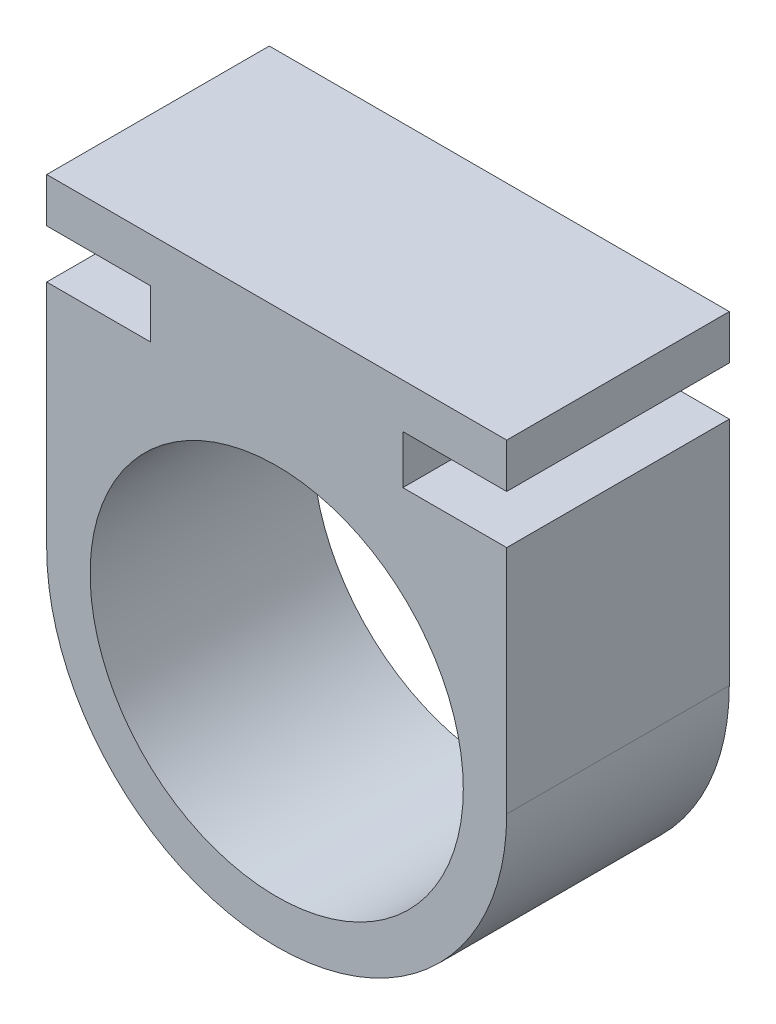
ISO-10303-21;
HEADER;
FILE_DESCRIPTION(('STEP AP214'),'2;1');
FILE_NAME('part.step','',(''),(''),'','','');
FILE_SCHEMA(('AUTOMOTIVE_DESIGN { 1 0 10303 214 1 1 1 1 }'));
ENDSEC;
DATA;
#1=APPLICATION_CONTEXT('core data for automotive mechanical design processes');
#2=APPLICATION_PROTOCOL_DEFINITION('international standard','automotive_design',2000,#1);
#3=PRODUCT_CONTEXT('',#1,'mechanical');
#4=PRODUCT('Part','Part','',(#3));
#5=PRODUCT_RELATED_PRODUCT_CATEGORY('part','',(#4));
#6=PRODUCT_DEFINITION_FORMATION('','',#4);
#7=PRODUCT_DEFINITION_CONTEXT('part definition',#1,'design');
#8=PRODUCT_DEFINITION('design','',#6,#7);
#9=PRODUCT_DEFINITION_SHAPE('','',#8);
#10=(LENGTH_UNIT() NAMED_UNIT(*) SI_UNIT(.MILLI.,.METRE.));
#11=(NAMED_UNIT(*) PLANE_ANGLE_UNIT() SI_UNIT($,.RADIAN.));
#12=(NAMED_UNIT(*) SI_UNIT($,.STERADIAN.) SOLID_ANGLE_UNIT());
#13=UNCERTAINTY_MEASURE_WITH_UNIT(LENGTH_MEASURE(1.E-05),#10,'distance_accuracy_value','');
#14=(GEOMETRIC_REPRESENTATION_CONTEXT(3) GLOBAL_UNCERTAINTY_ASSIGNED_CONTEXT((#13)) GLOBAL_UNIT_ASSIGNED_CONTEXT((#10,
#11,#12)) REPRESENTATION_CONTEXT('',''));
#15=CARTESIAN_POINT('',(0.,0.,0.));
#16=DIRECTION('',(0.,0.,1.));
#17=DIRECTION('',(1.,0.,0.));
#18=AXIS2_PLACEMENT_3D('',#15,#16,#17);
#19=CARTESIAN_POINT('',(0.,0.,15.));
#20=DIRECTION('',(0.,0.,-1.));
#21=DIRECTION('',(-1.,0.,0.));
#22=AXIS2_PLACEMENT_3D('',#19,#20,#21);
#23=CYLINDRICAL_SURFACE('',#22,15.5);
#24=CARTESIAN_POINT('',(0.,0.,0.));
#25=DIRECTION('',(0.,0.,1.));
#26=DIRECTION('',(1.,0.,0.));
#27=AXIS2_PLACEMENT_3D('',#24,#25,#26);
#28=CIRCLE('',#27,15.5);
#29=CARTESIAN_POINT('',(-15.5,0.,0.));
#30=VERTEX_POINT('',#29);
#31=CARTESIAN_POINT('',(15.5,0.,0.));
#32=VERTEX_POINT('',#31);
#33=EDGE_CURVE('E162',#30,#32,#28,.T.);
#34=ORIENTED_EDGE('',*,*,#33,.T.);
#35=DIRECTION('',(0.,0.,-1.));
#36=VECTOR('',#35,1.);
#37=CARTESIAN_POINT('',(15.5,0.,15.));
#38=LINE('',#37,#36);
#39=CARTESIAN_POINT('',(15.5,0.,15.));
#40=VERTEX_POINT('',#39);
#41=EDGE_CURVE('E11',#40,#32,#38,.T.);
#42=ORIENTED_EDGE('',*,*,#41,.F.);
#43=CARTESIAN_POINT('',(0.,0.,15.));
#44=DIRECTION('',(0.,0.,1.));
#45=DIRECTION('',(1.,0.,0.));
#46=AXIS2_PLACEMENT_3D('',#43,#44,#45);
#47=CIRCLE('',#46,15.5);
#48=CARTESIAN_POINT('',(-15.5,0.,15.));
#49=VERTEX_POINT('',#48);
#50=EDGE_CURVE('E194',#49,#40,#47,.T.);
#51=ORIENTED_EDGE('',*,*,#50,.F.);
#52=DIRECTION('',(0.,0.,-1.));
#53=VECTOR('',#52,1.);
#54=CARTESIAN_POINT('',(-15.5,0.,15.));
#55=LINE('',#54,#53);
#56=EDGE_CURVE('E50',#49,#30,#55,.T.);
#57=ORIENTED_EDGE('',*,*,#56,.T.);
#58=EDGE_LOOP('',(#34,#42,#51,#57));
#59=FACE_BOUND('',#58,.T.);
#60=ADVANCED_FACE('F34',(#59),#23,.T.);
#61=CARTESIAN_POINT('',(15.5,0.,15.));
#62=DIRECTION('',(-1.,0.,0.));
#63=DIRECTION('',(0.,0.,1.));
#64=AXIS2_PLACEMENT_3D('',#61,#62,#63);
#65=PLANE('',#64);
#66=DIRECTION('',(0.,1.,0.));
#67=VECTOR('',#66,1.);
#68=CARTESIAN_POINT('',(15.5,0.,0.));
#69=LINE('',#68,#67);
#70=CARTESIAN_POINT('',(15.5,15.55,0.));
#71=VERTEX_POINT('',#70);
#72=EDGE_CURVE('E164',#32,#71,#69,.T.);
#73=ORIENTED_EDGE('',*,*,#72,.T.);
#74=DIRECTION('',(0.,0.,-1.));
#75=VECTOR('',#74,1.);
#76=CARTESIAN_POINT('',(15.5,15.55,15.));
#77=LINE('',#76,#75);
#78=CARTESIAN_POINT('',(15.5,15.55,15.));
#79=VERTEX_POINT('',#78);
#80=EDGE_CURVE('E42',#79,#71,#77,.T.);
#81=ORIENTED_EDGE('',*,*,#80,.F.);
#82=DIRECTION('',(0.,1.,0.));
#83=VECTOR('',#82,1.);
#84=CARTESIAN_POINT('',(15.5,0.,15.));
#85=LINE('',#84,#83);
#86=EDGE_CURVE('E101',#40,#79,#85,.T.);
#87=ORIENTED_EDGE('',*,*,#86,.F.);
#88=ORIENTED_EDGE('',*,*,#41,.T.);
#89=EDGE_LOOP('',(#73,#81,#87,#88));
#90=FACE_BOUND('',#89,.T.);
#91=ADVANCED_FACE('F259',(#90),#65,.F.);
#92=CARTESIAN_POINT('',(0.,15.55,15.));
#93=DIRECTION('',(0.,-1.,0.));
#94=DIRECTION('',(0.,0.,-1.));
#95=AXIS2_PLACEMENT_3D('',#92,#93,#94);
#96=PLANE('',#95);
#97=DIRECTION('',(-1.,0.,0.));
#98=VECTOR('',#97,1.);
#99=CARTESIAN_POINT('',(0.,15.55,0.));
#100=LINE('',#99,#98);
#101=CARTESIAN_POINT('',(8.5,15.55,0.));
#102=VERTEX_POINT('',#101);
#103=EDGE_CURVE('E166',#71,#102,#100,.T.);
#104=ORIENTED_EDGE('',*,*,#103,.T.);
#105=DIRECTION('',(0.,0.,-1.));
#106=VECTOR('',#105,1.);
#107=CARTESIAN_POINT('',(8.5,15.55,15.));
#108=LINE('',#107,#106);
#109=CARTESIAN_POINT('',(8.5,15.55,15.));
#110=VERTEX_POINT('',#109);
#111=EDGE_CURVE('E209',#110,#102,#108,.T.);
#112=ORIENTED_EDGE('',*,*,#111,.F.);
#113=DIRECTION('',(-1.,0.,0.));
#114=VECTOR('',#113,1.);
#115=CARTESIAN_POINT('',(0.,15.55,15.));
#116=LINE('',#115,#114);
#117=EDGE_CURVE('E146',#79,#110,#116,.T.);
#118=ORIENTED_EDGE('',*,*,#117,.F.);
#119=ORIENTED_EDGE('',*,*,#80,.T.);
#120=EDGE_LOOP('',(#104,#112,#118,#119));
#121=FACE_BOUND('',#120,.T.);
#122=ADVANCED_FACE('F214',(#121),#96,.F.);
#123=CARTESIAN_POINT('',(8.5,0.,15.));
#124=DIRECTION('',(1.,0.,0.));
#125=DIRECTION('',(0.,0.,-1.));
#126=AXIS2_PLACEMENT_3D('',#123,#124,#125);
#127=PLANE('',#126);
#128=DIRECTION('',(0.,-1.,0.));
#129=VECTOR('',#128,1.);
#130=CARTESIAN_POINT('',(8.5,0.,0.));
#131=LINE('',#130,#129);
#132=CARTESIAN_POINT('',(8.5,18.825,0.));
#133=VERTEX_POINT('',#132);
#134=EDGE_CURVE('E169',#133,#102,#131,.T.);
#135=ORIENTED_EDGE('',*,*,#134,.F.);
#136=DIRECTION('',(0.,0.,-1.));
#137=VECTOR('',#136,1.);
#138=CARTESIAN_POINT('',(8.5,18.825,15.));
#139=LINE('',#138,#137);
#140=CARTESIAN_POINT('',(8.5,18.825,15.));
#141=VERTEX_POINT('',#140);
#142=EDGE_CURVE('E207',#141,#133,#139,.T.);
#143=ORIENTED_EDGE('',*,*,#142,.F.);
#144=DIRECTION('',(0.,-1.,0.));
#145=VECTOR('',#144,1.);
#146=CARTESIAN_POINT('',(8.5,0.,15.));
#147=LINE('',#146,#145);
#148=EDGE_CURVE('E227',#141,#110,#147,.T.);
#149=ORIENTED_EDGE('',*,*,#148,.T.);
#150=ORIENTED_EDGE('',*,*,#111,.T.);
#151=EDGE_LOOP('',(#135,#143,#149,#150));
#152=FACE_BOUND('',#151,.T.);
#153=ADVANCED_FACE('F223',(#152),#127,.T.);
#154=CARTESIAN_POINT('',(0.,18.825,15.));
#155=DIRECTION('',(0.,1.,0.));
#156=DIRECTION('',(0.,0.,1.));
#157=AXIS2_PLACEMENT_3D('',#154,#155,#156);
#158=PLANE('',#157);
#159=DIRECTION('',(1.,0.,0.));
#160=VECTOR('',#159,1.);
#161=CARTESIAN_POINT('',(0.,18.825,0.));
#162=LINE('',#161,#160);
#163=CARTESIAN_POINT('',(15.5,18.825,0.));
#164=VERTEX_POINT('',#163);
#165=EDGE_CURVE('E173',#133,#164,#162,.T.);
#166=ORIENTED_EDGE('',*,*,#165,.T.);
#167=DIRECTION('',(0.,0.,-1.));
#168=VECTOR('',#167,1.);
#169=CARTESIAN_POINT('',(15.5,18.825,15.));
#170=LINE('',#169,#168);
#171=CARTESIAN_POINT('',(15.5,18.825,15.));
#172=VERTEX_POINT('',#171);
#173=EDGE_CURVE('E204',#172,#164,#170,.T.);
#174=ORIENTED_EDGE('',*,*,#173,.F.);
#175=DIRECTION('',(1.,0.,0.));
#176=VECTOR('',#175,1.);
#177=CARTESIAN_POINT('',(0.,18.825,15.));
#178=LINE('',#177,#176);
#179=EDGE_CURVE('E228',#141,#172,#178,.T.);
#180=ORIENTED_EDGE('',*,*,#179,.F.);
#181=ORIENTED_EDGE('',*,*,#142,.T.);
#182=EDGE_LOOP('',(#166,#174,#180,#181));
#183=FACE_BOUND('',#182,.T.);
#184=ADVANCED_FACE('F387',(#183),#158,.F.);
#185=CARTESIAN_POINT('',(15.5,0.,15.));
#186=DIRECTION('',(-1.,0.,0.));
#187=DIRECTION('',(0.,0.,1.));
#188=AXIS2_PLACEMENT_3D('',#185,#186,#187);
#189=PLANE('',#188);
#190=DIRECTION('',(0.,1.,0.));
#191=VECTOR('',#190,1.);
#192=CARTESIAN_POINT('',(15.5,0.,0.));
#193=LINE('',#192,#191);
#194=CARTESIAN_POINT('',(15.5,21.825,0.));
#195=VERTEX_POINT('',#194);
#196=EDGE_CURVE('E175',#164,#195,#193,.T.);
#197=ORIENTED_EDGE('',*,*,#196,.T.);
#198=DIRECTION('',(0.,0.,-1.));
#199=VECTOR('',#198,1.);
#200=CARTESIAN_POINT('',(15.5,21.825,15.));
#201=LINE('',#200,#199);
#202=CARTESIAN_POINT('',(15.5,21.825,15.));
#203=VERTEX_POINT('',#202);
#204=EDGE_CURVE('E202',#203,#195,#201,.T.);
#205=ORIENTED_EDGE('',*,*,#204,.F.);
#206=DIRECTION('',(0.,1.,0.));
#207=VECTOR('',#206,1.);
#208=CARTESIAN_POINT('',(15.5,0.,15.));
#209=LINE('',#208,#207);
#210=EDGE_CURVE('E230',#172,#203,#209,.T.);
#211=ORIENTED_EDGE('',*,*,#210,.F.);
#212=ORIENTED_EDGE('',*,*,#173,.T.);
#213=EDGE_LOOP('',(#197,#205,#211,#212));
#214=FACE_BOUND('',#213,.T.);
#215=ADVANCED_FACE('F376',(#214),#189,.F.);
#216=CARTESIAN_POINT('',(0.,21.825,15.));
#217=DIRECTION('',(0.,1.,0.));
#218=DIRECTION('',(0.,0.,1.));
#219=AXIS2_PLACEMENT_3D('',#216,#217,#218);
#220=PLANE('',#219);
#221=DIRECTION('',(1.,0.,0.));
#222=VECTOR('',#221,1.);
#223=CARTESIAN_POINT('',(0.,21.825,0.));
#224=LINE('',#223,#222);
#225=CARTESIAN_POINT('',(-15.5,21.825,0.));
#226=VERTEX_POINT('',#225);
#227=EDGE_CURVE('E178',#226,#195,#224,.T.);
#228=ORIENTED_EDGE('',*,*,#227,.F.);
#229=DIRECTION('',(0.,0.,-1.));
#230=VECTOR('',#229,1.);
#231=CARTESIAN_POINT('',(-15.5,21.825,15.));
#232=LINE('',#231,#230);
#233=CARTESIAN_POINT('',(-15.5,21.825,15.));
#234=VERTEX_POINT('',#233);
#235=EDGE_CURVE('E200',#234,#226,#232,.T.);
#236=ORIENTED_EDGE('',*,*,#235,.F.);
#237=DIRECTION('',(1.,0.,0.));
#238=VECTOR('',#237,1.);
#239=CARTESIAN_POINT('',(0.,21.825,15.));
#240=LINE('',#239,#238);
#241=EDGE_CURVE('E235',#234,#203,#240,.T.);
#242=ORIENTED_EDGE('',*,*,#241,.T.);
#243=ORIENTED_EDGE('',*,*,#204,.T.);
#244=EDGE_LOOP('',(#228,#236,#242,#243));
#245=FACE_BOUND('',#244,.T.);
#246=ADVANCED_FACE('F246',(#245),#220,.T.);
#247=CARTESIAN_POINT('',(-15.5,0.,15.));
#248=DIRECTION('',(-1.,0.,0.));
#249=DIRECTION('',(0.,0.,1.));
#250=AXIS2_PLACEMENT_3D('',#247,#248,#249);
#251=PLANE('',#250);
#252=DIRECTION('',(0.,1.,0.));
#253=VECTOR('',#252,1.);
#254=CARTESIAN_POINT('',(-15.5,0.,0.));
#255=LINE('',#254,#253);
#256=CARTESIAN_POINT('',(-15.5,18.825,0.));
#257=VERTEX_POINT('',#256);
#258=EDGE_CURVE('E181',#257,#226,#255,.T.);
#259=ORIENTED_EDGE('',*,*,#258,.F.);
#260=DIRECTION('',(0.,0.,-1.));
#261=VECTOR('',#260,1.);
#262=CARTESIAN_POINT('',(-15.5,18.825,15.));
#263=LINE('',#262,#261);
#264=CARTESIAN_POINT('',(-15.5,18.825,15.));
#265=VERTEX_POINT('',#264);
#266=EDGE_CURVE('E198',#265,#257,#263,.T.);
#267=ORIENTED_EDGE('',*,*,#266,.F.);
#268=DIRECTION('',(0.,1.,0.));
#269=VECTOR('',#268,1.);
#270=CARTESIAN_POINT('',(-15.5,0.,15.));
#271=LINE('',#270,#269);
#272=EDGE_CURVE('E154',#265,#234,#271,.T.);
#273=ORIENTED_EDGE('',*,*,#272,.T.);
#274=ORIENTED_EDGE('',*,*,#235,.T.);
#275=EDGE_LOOP('',(#259,#267,#273,#274));
#276=FACE_BOUND('',#275,.T.);
#277=ADVANCED_FACE('F240',(#276),#251,.T.);
#278=CARTESIAN_POINT('',(0.,18.825,15.));
#279=DIRECTION('',(0.,1.,0.));
#280=DIRECTION('',(0.,0.,1.));
#281=AXIS2_PLACEMENT_3D('',#278,#279,#280);
#282=PLANE('',#281);
#283=DIRECTION('',(1.,0.,0.));
#284=VECTOR('',#283,1.);
#285=CARTESIAN_POINT('',(0.,18.825,0.));
#286=LINE('',#285,#284);
#287=CARTESIAN_POINT('',(-8.5,18.825,0.));
#288=VERTEX_POINT('',#287);
#289=EDGE_CURVE('E184',#257,#288,#286,.T.);
#290=ORIENTED_EDGE('',*,*,#289,.T.);
#291=DIRECTION('',(0.,0.,-1.));
#292=VECTOR('',#291,1.);
#293=CARTESIAN_POINT('',(-8.5,18.825,15.));
#294=LINE('',#293,#292);
#295=CARTESIAN_POINT('',(-8.5,18.825,15.));
#296=VERTEX_POINT('',#295);
#297=EDGE_CURVE('E138',#296,#288,#294,.T.);
#298=ORIENTED_EDGE('',*,*,#297,.F.);
#299=DIRECTION('',(1.,0.,0.));
#300=VECTOR('',#299,1.);
#301=CARTESIAN_POINT('',(0.,18.825,15.));
#302=LINE('',#301,#300);
#303=EDGE_CURVE('E151',#265,#296,#302,.T.);
#304=ORIENTED_EDGE('',*,*,#303,.F.);
#305=ORIENTED_EDGE('',*,*,#266,.T.);
#306=EDGE_LOOP('',(#290,#298,#304,#305));
#307=FACE_BOUND('',#306,.T.);
#308=ADVANCED_FACE('F249',(#307),#282,.F.);
#309=CARTESIAN_POINT('',(-8.5,0.,15.));
#310=DIRECTION('',(-1.,0.,0.));
#311=DIRECTION('',(0.,0.,1.));
#312=AXIS2_PLACEMENT_3D('',#309,#310,#311);
#313=PLANE('',#312);
#314=DIRECTION('',(0.,1.,0.));
#315=VECTOR('',#314,1.);
#316=CARTESIAN_POINT('',(-8.5,0.,0.));
#317=LINE('',#316,#315);
#318=CARTESIAN_POINT('',(-8.5,15.55,0.));
#319=VERTEX_POINT('',#318);
#320=EDGE_CURVE('E135',#319,#288,#317,.T.);
#321=ORIENTED_EDGE('',*,*,#320,.F.);
#322=DIRECTION('',(0.,0.,-1.));
#323=VECTOR('',#322,1.);
#324=CARTESIAN_POINT('',(-8.5,15.55,15.));
#325=LINE('',#324,#323);
#326=CARTESIAN_POINT('',(-8.5,15.55,15.));
#327=VERTEX_POINT('',#326);
#328=EDGE_CURVE('E129',#327,#319,#325,.T.);
#329=ORIENTED_EDGE('',*,*,#328,.F.);
#330=DIRECTION('',(0.,1.,0.));
#331=VECTOR('',#330,1.);
#332=CARTESIAN_POINT('',(-8.5,0.,15.));
#333=LINE('',#332,#331);
#334=EDGE_CURVE('E133',#327,#296,#333,.T.);
#335=ORIENTED_EDGE('',*,*,#334,.T.);
#336=ORIENTED_EDGE('',*,*,#297,.T.);
#337=EDGE_LOOP('',(#321,#329,#335,#336));
#338=FACE_BOUND('',#337,.T.);
#339=ADVANCED_FACE('F131',(#338),#313,.T.);
#340=CARTESIAN_POINT('',(-15.5,15.55,0.));
#341=VERTEX_POINT('',#340);
#342=EDGE_CURVE('E170',#319,#341,#100,.T.);
#343=ORIENTED_EDGE('',*,*,#342,.T.);
#344=DIRECTION('',(0.,0.,-1.));
#345=VECTOR('',#344,1.);
#346=CARTESIAN_POINT('',(-15.5,15.55,15.));
#347=LINE('',#346,#345);
#348=CARTESIAN_POINT('',(-15.5,15.55,15.));
#349=VERTEX_POINT('',#348);
#350=EDGE_CURVE('E89',#349,#341,#347,.T.);
#351=ORIENTED_EDGE('',*,*,#350,.F.);
#352=EDGE_CURVE('E140',#327,#349,#116,.T.);
#353=ORIENTED_EDGE('',*,*,#352,.F.);
#354=ORIENTED_EDGE('',*,*,#328,.T.);
#355=EDGE_LOOP('',(#343,#351,#353,#354));
#356=FACE_BOUND('',#355,.T.);
#357=ADVANCED_FACE('F141',(#356),#96,.F.);
#358=CARTESIAN_POINT('',(-15.5,0.,15.));
#359=DIRECTION('',(-1.,0.,0.));
#360=DIRECTION('',(0.,0.,1.));
#361=AXIS2_PLACEMENT_3D('',#358,#359,#360);
#362=PLANE('',#361);
#363=DIRECTION('',(0.,1.,0.));
#364=VECTOR('',#363,1.);
#365=CARTESIAN_POINT('',(-15.5,0.,0.));
#366=LINE('',#365,#364);
#367=EDGE_CURVE('E188',#30,#341,#366,.T.);
#368=ORIENTED_EDGE('',*,*,#367,.F.);
#369=ORIENTED_EDGE('',*,*,#56,.F.);
#370=DIRECTION('',(0.,1.,0.));
#371=VECTOR('',#370,1.);
#372=CARTESIAN_POINT('',(-15.5,0.,15.));
#373=LINE('',#372,#371);
#374=EDGE_CURVE('E144',#49,#349,#373,.T.);
#375=ORIENTED_EDGE('',*,*,#374,.T.);
#376=ORIENTED_EDGE('',*,*,#350,.T.);
#377=EDGE_LOOP('',(#368,#369,#375,#376));
#378=FACE_BOUND('',#377,.T.);
#379=ADVANCED_FACE('F264',(#378),#362,.T.);
#380=CARTESIAN_POINT('',(0.,0.,15.));
#381=DIRECTION('',(0.,0.,-1.));
#382=DIRECTION('',(-1.,0.,0.));
#383=AXIS2_PLACEMENT_3D('',#380,#381,#382);
#384=CYLINDRICAL_SURFACE('',#383,12.575);
#385=CARTESIAN_POINT('',(0.,0.,15.));
#386=DIRECTION('',(0.,0.,1.));
#387=DIRECTION('',(1.,0.,0.));
#388=AXIS2_PLACEMENT_3D('',#385,#386,#387);
#389=CIRCLE('',#388,12.575);
#390=CARTESIAN_POINT('',(12.575,0.,15.));
#391=VERTEX_POINT('',#390);
#392=EDGE_CURVE('E159',#391,#391,#389,.T.);
#393=ORIENTED_EDGE('',*,*,#392,.T.);
#394=EDGE_LOOP('',(#393));
#395=FACE_BOUND('',#394,.T.);
#396=CARTESIAN_POINT('',(0.,0.,0.));
#397=DIRECTION('',(0.,0.,1.));
#398=DIRECTION('',(1.,0.,0.));
#399=AXIS2_PLACEMENT_3D('',#396,#397,#398);
#400=CIRCLE('',#399,12.575);
#401=CARTESIAN_POINT('',(12.575,0.,0.));
#402=VERTEX_POINT('',#401);
#403=EDGE_CURVE('E191',#402,#402,#400,.T.);
#404=ORIENTED_EDGE('',*,*,#403,.F.);
#405=EDGE_LOOP('',(#404));
#406=FACE_BOUND('',#405,.T.);
#407=ADVANCED_FACE('F266',(#395,#406),#384,.F.);
#408=CARTESIAN_POINT('',(0.,0.,15.));
#409=DIRECTION('',(0.,0.,1.));
#410=DIRECTION('',(1.,0.,0.));
#411=AXIS2_PLACEMENT_3D('',#408,#409,#410);
#412=PLANE('',#411);
#413=ORIENTED_EDGE('',*,*,#50,.T.);
#414=ORIENTED_EDGE('',*,*,#86,.T.);
#415=ORIENTED_EDGE('',*,*,#117,.T.);
#416=ORIENTED_EDGE('',*,*,#148,.F.);
#417=ORIENTED_EDGE('',*,*,#179,.T.);
#418=ORIENTED_EDGE('',*,*,#210,.T.);
#419=ORIENTED_EDGE('',*,*,#241,.F.);
#420=ORIENTED_EDGE('',*,*,#272,.F.);
#421=ORIENTED_EDGE('',*,*,#303,.T.);
#422=ORIENTED_EDGE('',*,*,#334,.F.);
#423=ORIENTED_EDGE('',*,*,#352,.T.);
#424=ORIENTED_EDGE('',*,*,#374,.F.);
#425=EDGE_LOOP('',(#413,#414,#415,#416,#417,#418,#419,#420,#421,#422,#423,#424));
#426=FACE_BOUND('',#425,.T.);
#427=ORIENTED_EDGE('',*,*,#392,.F.);
#428=EDGE_LOOP('',(#427));
#429=FACE_BOUND('',#428,.T.);
#430=ADVANCED_FACE('F147',(#426,#429),#412,.T.);
#431=CARTESIAN_POINT('',(0.,0.,0.));
#432=DIRECTION('',(0.,0.,1.));
#433=DIRECTION('',(1.,0.,0.));
#434=AXIS2_PLACEMENT_3D('',#431,#432,#433);
#435=PLANE('',#434);
#436=ORIENTED_EDGE('',*,*,#33,.F.);
#437=ORIENTED_EDGE('',*,*,#367,.T.);
#438=ORIENTED_EDGE('',*,*,#342,.F.);
#439=ORIENTED_EDGE('',*,*,#320,.T.);
#440=ORIENTED_EDGE('',*,*,#289,.F.);
#441=ORIENTED_EDGE('',*,*,#258,.T.);
#442=ORIENTED_EDGE('',*,*,#227,.T.);
#443=ORIENTED_EDGE('',*,*,#196,.F.);
#444=ORIENTED_EDGE('',*,*,#165,.F.);
#445=ORIENTED_EDGE('',*,*,#134,.T.);
#446=ORIENTED_EDGE('',*,*,#103,.F.);
#447=ORIENTED_EDGE('',*,*,#72,.F.);
#448=EDGE_LOOP('',(#436,#437,#438,#439,#440,#441,#442,#443,#444,#445,#446,#447));
#449=FACE_BOUND('',#448,.T.);
#450=ORIENTED_EDGE('',*,*,#403,.T.);
#451=EDGE_LOOP('',(#450));
#452=FACE_BOUND('',#451,.T.);
#453=ADVANCED_FACE('F217',(#449,#452),#435,.F.);
#454=CLOSED_SHELL('',(#60,#91,#122,#153,#184,#215,#246,#277,#308,#339,#357,#379,#407,#430,#453));
#455=MANIFOLD_SOLID_BREP('B2',#454);
#456=ADVANCED_BREP_SHAPE_REPRESENTATION('',(#18,#455),#14);
#457=SHAPE_DEFINITION_REPRESENTATION(#9,#456);
ENDSEC;
END-ISO-10303-21;
